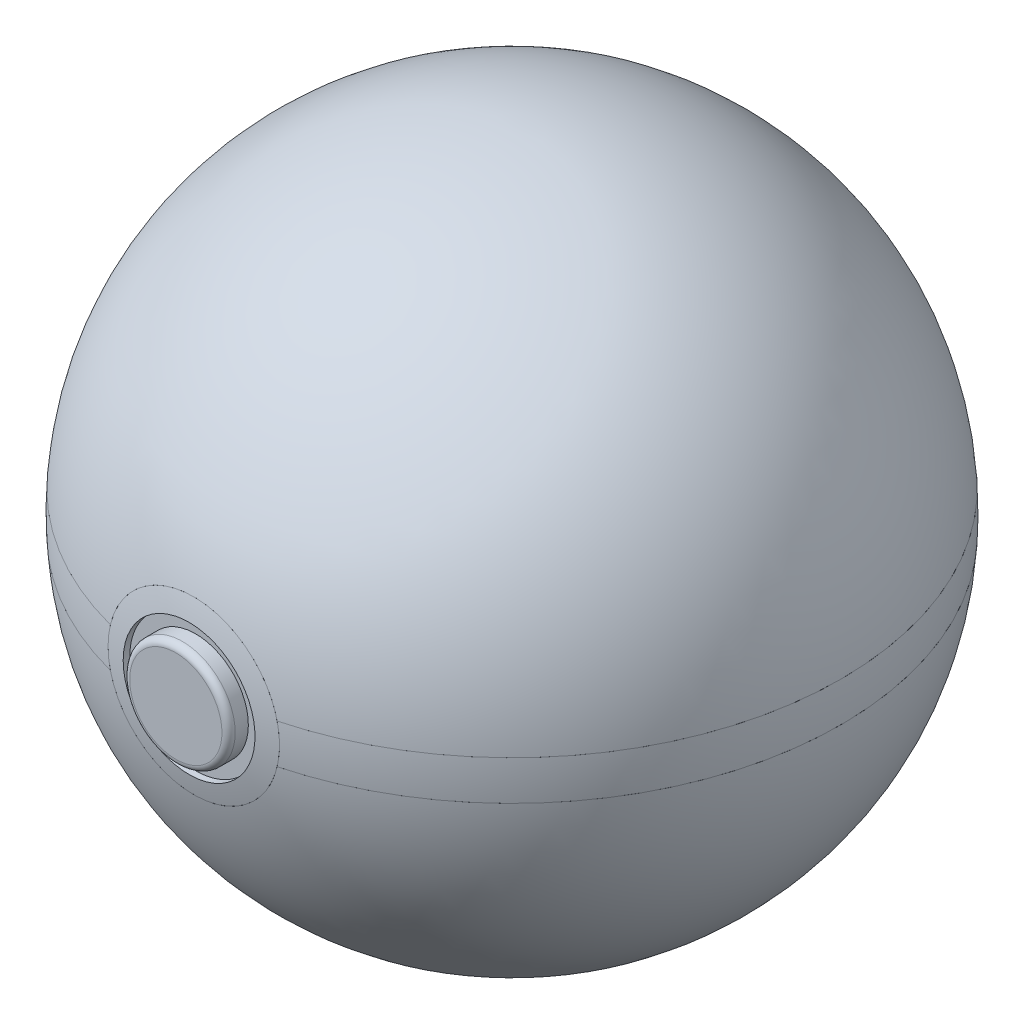
ISO-10303-21;
HEADER;
FILE_DESCRIPTION(('STEP AP214'),'2;1');
FILE_NAME('part.step','',(''),(''),'','','');
FILE_SCHEMA(('AUTOMOTIVE_DESIGN { 1 0 10303 214 1 1 1 1 }'));
ENDSEC;
DATA;
#1=APPLICATION_CONTEXT('core data for automotive mechanical design processes');
#2=APPLICATION_PROTOCOL_DEFINITION('international standard','automotive_design',2000,#1);
#3=PRODUCT_CONTEXT('',#1,'mechanical');
#4=PRODUCT('Part','Part','',(#3));
#5=PRODUCT_RELATED_PRODUCT_CATEGORY('part','',(#4));
#6=PRODUCT_DEFINITION_FORMATION('','',#4);
#7=PRODUCT_DEFINITION_CONTEXT('part definition',#1,'design');
#8=PRODUCT_DEFINITION('design','',#6,#7);
#9=PRODUCT_DEFINITION_SHAPE('','',#8);
#10=(LENGTH_UNIT() NAMED_UNIT(*) SI_UNIT(.MILLI.,.METRE.));
#11=(NAMED_UNIT(*) PLANE_ANGLE_UNIT() SI_UNIT($,.RADIAN.));
#12=(NAMED_UNIT(*) SI_UNIT($,.STERADIAN.) SOLID_ANGLE_UNIT());
#13=UNCERTAINTY_MEASURE_WITH_UNIT(LENGTH_MEASURE(1.E-05),#10,'distance_accuracy_value','');
#14=(GEOMETRIC_REPRESENTATION_CONTEXT(3) GLOBAL_UNCERTAINTY_ASSIGNED_CONTEXT((#13)) GLOBAL_UNIT_ASSIGNED_CONTEXT((#10,
#11,#12)) REPRESENTATION_CONTEXT('',''));
#15=CARTESIAN_POINT('',(0.,0.,0.));
#16=DIRECTION('',(0.,0.,1.));
#17=DIRECTION('',(1.,0.,0.));
#18=AXIS2_PLACEMENT_3D('',#15,#16,#17);
#19=CARTESIAN_POINT('',(0.,0.,51.));
#20=DIRECTION('',(0.,0.,-1.));
#21=DIRECTION('',(-1.,0.,0.));
#22=AXIS2_PLACEMENT_3D('',#19,#20,#21);
#23=CYLINDRICAL_SURFACE('',#22,8.);
#24=CARTESIAN_POINT('',(0.,0.,50.));
#25=DIRECTION('',(0.,0.,1.));
#26=DIRECTION('',(1.,0.,0.));
#27=AXIS2_PLACEMENT_3D('',#24,#25,#26);
#28=CIRCLE('',#27,8.);
#29=CARTESIAN_POINT('',(8.,0.,50.));
#30=VERTEX_POINT('',#29);
#31=EDGE_CURVE('E11',#30,#30,#28,.F.);
#32=ORIENTED_EDGE('',*,*,#31,.T.);
#33=EDGE_LOOP('',(#32));
#34=FACE_BOUND('',#33,.T.);
#35=CARTESIAN_POINT('',(0.,0.,48.));
#36=DIRECTION('',(0.,0.,1.));
#37=DIRECTION('',(1.,0.,0.));
#38=AXIS2_PLACEMENT_3D('',#35,#36,#37);
#39=CIRCLE('',#38,8.);
#40=CARTESIAN_POINT('',(8.,0.,48.));
#41=VERTEX_POINT('',#40);
#42=EDGE_CURVE('E63',#41,#41,#39,.T.);
#43=ORIENTED_EDGE('',*,*,#42,.T.);
#44=EDGE_LOOP('',(#43));
#45=FACE_BOUND('',#44,.T.);
#46=ADVANCED_FACE('F52',(#34,#45),#23,.T.);
#47=CARTESIAN_POINT('',(0.,0.,51.));
#48=DIRECTION('',(0.,0.,1.));
#49=DIRECTION('',(1.,0.,0.));
#50=AXIS2_PLACEMENT_3D('',#47,#48,#49);
#51=PLANE('',#50);
#52=CARTESIAN_POINT('',(0.,0.,51.));
#53=DIRECTION('',(0.,0.,1.));
#54=DIRECTION('',(1.,0.,0.));
#55=AXIS2_PLACEMENT_3D('',#52,#53,#54);
#56=CIRCLE('',#55,7.);
#57=CARTESIAN_POINT('',(7.,0.,51.));
#58=VERTEX_POINT('',#57);
#59=EDGE_CURVE('E59',#58,#58,#56,.T.);
#60=ORIENTED_EDGE('',*,*,#59,.T.);
#61=EDGE_LOOP('',(#60));
#62=FACE_BOUND('',#61,.T.);
#63=ADVANCED_FACE('F73',(#62),#51,.T.);
#64=CARTESIAN_POINT('',(0.,0.,48.));
#65=DIRECTION('',(0.,0.,1.));
#66=DIRECTION('',(1.,0.,0.));
#67=AXIS2_PLACEMENT_3D('',#64,#65,#66);
#68=PLANE('',#67);
#69=ORIENTED_EDGE('',*,*,#42,.F.);
#70=EDGE_LOOP('',(#69));
#71=FACE_BOUND('',#70,.T.);
#72=ADVANCED_FACE('F71',(#71),#68,.F.);
#73=CARTESIAN_POINT('',(0.,0.,50.));
#74=DIRECTION('',(0.,0.,1.));
#75=DIRECTION('',(1.,0.,0.));
#76=AXIS2_PLACEMENT_3D('',#73,#74,#75);
#77=TOROIDAL_SURFACE('',#76,7.,1.);
#78=ORIENTED_EDGE('',*,*,#31,.F.);
#79=EDGE_LOOP('',(#78));
#80=FACE_BOUND('',#79,.T.);
#81=ORIENTED_EDGE('',*,*,#59,.F.);
#82=EDGE_LOOP('',(#81));
#83=FACE_BOUND('',#82,.T.);
#84=ADVANCED_FACE('F54',(#80,#83),#77,.T.);
#85=CLOSED_SHELL('',(#46,#63,#72,#84));
#86=MANIFOLD_SOLID_BREP('B2',#85);
#87=CARTESIAN_POINT('',(0.,0.,48.));
#88=DIRECTION('',(0.,0.,-1.));
#89=DIRECTION('',(-1.,0.,0.));
#90=AXIS2_PLACEMENT_3D('',#87,#88,#89);
#91=CYLINDRICAL_SURFACE('',#90,10.);
#92=CARTESIAN_POINT('',(0.,0.,48.));
#93=DIRECTION('',(0.,0.,1.));
#94=DIRECTION('',(1.,0.,0.));
#95=AXIS2_PLACEMENT_3D('',#92,#93,#94);
#96=CIRCLE('',#95,10.);
#97=CARTESIAN_POINT('',(10.,0.,48.));
#98=VERTEX_POINT('',#97);
#99=EDGE_CURVE('E51',#98,#98,#96,.T.);
#100=ORIENTED_EDGE('',*,*,#99,.F.);
#101=EDGE_LOOP('',(#100));
#102=FACE_BOUND('',#101,.T.);
#103=CARTESIAN_POINT('',(0.,0.,0.));
#104=DIRECTION('',(0.,0.,1.));
#105=DIRECTION('',(1.,0.,0.));
#106=AXIS2_PLACEMENT_3D('',#103,#104,#105);
#107=CIRCLE('',#106,10.);
#108=CARTESIAN_POINT('',(10.,0.,0.));
#109=VERTEX_POINT('',#108);
#110=EDGE_CURVE('E133',#109,#109,#107,.T.);
#111=ORIENTED_EDGE('',*,*,#110,.T.);
#112=EDGE_LOOP('',(#111));
#113=FACE_BOUND('',#112,.T.);
#114=ADVANCED_FACE('F130',(#102,#113),#91,.T.);
#115=CARTESIAN_POINT('',(0.,0.,48.));
#116=DIRECTION('',(0.,0.,1.));
#117=DIRECTION('',(1.,0.,0.));
#118=AXIS2_PLACEMENT_3D('',#115,#116,#117);
#119=PLANE('',#118);
#120=ORIENTED_EDGE('',*,*,#99,.T.);
#121=EDGE_LOOP('',(#120));
#122=FACE_BOUND('',#121,.T.);
#123=ADVANCED_FACE('F145',(#122),#119,.T.);
#124=CARTESIAN_POINT('',(0.,0.,0.));
#125=DIRECTION('',(0.,0.,1.));
#126=DIRECTION('',(1.,0.,0.));
#127=AXIS2_PLACEMENT_3D('',#124,#125,#126);
#128=PLANE('',#127);
#129=ORIENTED_EDGE('',*,*,#110,.F.);
#130=EDGE_LOOP('',(#129));
#131=FACE_BOUND('',#130,.T.);
#132=ADVANCED_FACE('F143',(#131),#128,.F.);
#133=CLOSED_SHELL('',(#114,#123,#132));
#134=MANIFOLD_SOLID_BREP('B6',#133);
#135=CARTESIAN_POINT('',(0.,0.,0.));
#136=DIRECTION('',(0.,-1.,0.));
#137=DIRECTION('',(1.,0.,0.));
#138=AXIS2_PLACEMENT_3D('',#135,#136,#137);
#139=SPHERICAL_SURFACE('',#138,50.);
#140=CARTESIAN_POINT('',(0.,0.,0.));
#141=DIRECTION('',(0.,0.,-1.));
#142=DIRECTION('',(-1.,0.,0.));
#143=AXIS2_PLACEMENT_3D('',#140,#141,#142);
#144=SPHERICAL_SURFACE('',#143,50.);
#145=CARTESIAN_POINT('',(0.,0.,48.2804308182933));
#146=DIRECTION('',(0.,0.,-1.));
#147=DIRECTION('',(-1.,0.,0.));
#148=AXIS2_PLACEMENT_3D('',#145,#146,#147);
#149=CIRCLE('',#148,13.);
#150=CARTESIAN_POINT('',(-13.,0.,48.2804308182933));
#151=VERTEX_POINT('',#150);
#152=EDGE_CURVE('E129',#151,#151,#149,.F.);
#153=ORIENTED_EDGE('',*,*,#152,.T.);
#154=EDGE_LOOP('',(#153));
#155=FACE_BOUND('',#154,.T.);
#156=CARTESIAN_POINT('',(0.,0.,48.9897948556636));
#157=DIRECTION('',(0.,0.,-1.));
#158=DIRECTION('',(-1.,0.,0.));
#159=AXIS2_PLACEMENT_3D('',#156,#157,#158);
#160=CIRCLE('',#159,10.);
#161=CARTESIAN_POINT('',(-10.,0.,48.9897948556636));
#162=VERTEX_POINT('',#161);
#163=EDGE_CURVE('E192',#162,#162,#160,.T.);
#164=ORIENTED_EDGE('',*,*,#163,.T.);
#165=EDGE_LOOP('',(#164));
#166=FACE_BOUND('',#165,.T.);
#167=ADVANCED_FACE('F189',(#155,#166),#144,.T.);
#168=CARTESIAN_POINT('',(0.,0.,50.001));
#169=DIRECTION('',(0.,0.,-1.));
#170=DIRECTION('',(-1.,0.,0.));
#171=AXIS2_PLACEMENT_3D('',#168,#169,#170);
#172=CYLINDRICAL_SURFACE('',#171,13.);
#173=CARTESIAN_POINT('',(0.,0.,0.));
#174=DIRECTION('',(0.,0.,1.));
#175=DIRECTION('',(1.,0.,0.));
#176=AXIS2_PLACEMENT_3D('',#173,#174,#175);
#177=CIRCLE('',#176,13.);
#178=CARTESIAN_POINT('',(13.,0.,0.));
#179=VERTEX_POINT('',#178);
#180=EDGE_CURVE('E196',#179,#179,#177,.T.);
#181=ORIENTED_EDGE('',*,*,#180,.T.);
#182=EDGE_LOOP('',(#181));
#183=FACE_BOUND('',#182,.T.);
#184=ORIENTED_EDGE('',*,*,#152,.F.);
#185=EDGE_LOOP('',(#184));
#186=FACE_BOUND('',#185,.T.);
#187=ADVANCED_FACE('F218',(#183,#186),#172,.T.);
#188=CARTESIAN_POINT('',(0.,0.,0.));
#189=DIRECTION('',(0.,0.,1.));
#190=DIRECTION('',(1.,0.,0.));
#191=AXIS2_PLACEMENT_3D('',#188,#189,#190);
#192=PLANE('',#191);
#193=CARTESIAN_POINT('',(0.,0.,0.));
#194=DIRECTION('',(0.,0.,1.));
#195=DIRECTION('',(1.,0.,0.));
#196=AXIS2_PLACEMENT_3D('',#193,#194,#195);
#197=CIRCLE('',#196,10.);
#198=CARTESIAN_POINT('',(10.,0.,0.));
#199=VERTEX_POINT('',#198);
#200=EDGE_CURVE('E202',#199,#199,#197,.T.);
#201=ORIENTED_EDGE('',*,*,#200,.T.);
#202=EDGE_LOOP('',(#201));
#203=FACE_BOUND('',#202,.T.);
#204=ORIENTED_EDGE('',*,*,#180,.F.);
#205=EDGE_LOOP('',(#204));
#206=FACE_BOUND('',#205,.T.);
#207=ADVANCED_FACE('F213',(#203,#206),#192,.F.);
#208=CARTESIAN_POINT('',(0.,0.,70.));
#209=DIRECTION('',(0.,0.,-1.));
#210=DIRECTION('',(-1.,0.,0.));
#211=AXIS2_PLACEMENT_3D('',#208,#209,#210);
#212=CYLINDRICAL_SURFACE('',#211,10.);
#213=ORIENTED_EDGE('',*,*,#163,.F.);
#214=EDGE_LOOP('',(#213));
#215=FACE_BOUND('',#214,.T.);
#216=ORIENTED_EDGE('',*,*,#200,.F.);
#217=EDGE_LOOP('',(#216));
#218=FACE_BOUND('',#217,.T.);
#219=ADVANCED_FACE('F210',(#215,#218),#212,.F.);
#220=CLOSED_SHELL('',(#167,#187,#207,#219));
#221=MANIFOLD_SOLID_BREP('B46',#220);
#222=CARTESIAN_POINT('',(0.,0.,0.));
#223=DIRECTION('',(0.,1.,0.));
#224=DIRECTION('',(1.,0.,0.));
#225=AXIS2_PLACEMENT_3D('',#222,#223,#224);
#226=SPHERICAL_SURFACE('',#225,50.);
#227=CARTESIAN_POINT('',(0.,0.,48.2804308182933));
#228=DIRECTION('',(0.,0.,-1.));
#229=DIRECTION('',(-1.,0.,0.));
#230=AXIS2_PLACEMENT_3D('',#227,#228,#229);
#231=CIRCLE('',#230,13.);
#232=CARTESIAN_POINT('',(12.6491106406735,-2.99999999999995,48.2804308182933));
#233=VERTEX_POINT('',#232);
#234=CARTESIAN_POINT('',(12.6491106406735,3.00000000000005,48.2804308182933));
#235=VERTEX_POINT('',#234);
#236=EDGE_CURVE('E292',#233,#235,#231,.F.);
#237=ORIENTED_EDGE('',*,*,#236,.F.);
#238=CARTESIAN_POINT('',(0.,-2.99999999999994,0.));
#239=DIRECTION('',(0.,1.,0.));
#240=DIRECTION('',(-1.,0.,0.));
#241=AXIS2_PLACEMENT_3D('',#238,#239,#240);
#242=CIRCLE('',#241,49.9099188538711);
#243=CARTESIAN_POINT('',(-12.6491106406735,-2.99999999999992,48.2804308182933));
#244=VERTEX_POINT('',#243);
#245=EDGE_CURVE('E317',#233,#244,#242,.T.);
#246=ORIENTED_EDGE('',*,*,#245,.T.);
#247=CARTESIAN_POINT('',(-12.6491106406735,3.00000000000008,48.2804308182933));
#248=VERTEX_POINT('',#247);
#249=EDGE_CURVE('E327',#248,#244,#231,.F.);
#250=ORIENTED_EDGE('',*,*,#249,.F.);
#251=CARTESIAN_POINT('',(0.,3.00000000000006,0.));
#252=DIRECTION('',(0.,1.,0.));
#253=DIRECTION('',(-1.,0.,0.));
#254=AXIS2_PLACEMENT_3D('',#251,#252,#253);
#255=CIRCLE('',#254,49.9099188538711);
#256=EDGE_CURVE('E334',#235,#248,#255,.T.);
#257=ORIENTED_EDGE('',*,*,#256,.F.);
#258=EDGE_LOOP('',(#237,#246,#250,#257));
#259=FACE_BOUND('',#258,.T.);
#260=ADVANCED_FACE('F271',(#259),#226,.T.);
#261=CARTESIAN_POINT('',(49.9099188538711,2.99999999999997,0.));
#262=DIRECTION('',(0.,-1.,0.));
#263=DIRECTION('',(1.,0.,0.));
#264=AXIS2_PLACEMENT_3D('',#261,#262,#263);
#265=PLANE('',#264);
#266=DIRECTION('',(0.,0.,-1.));
#267=VECTOR('',#266,1.);
#268=CARTESIAN_POINT('',(-12.6491106406735,3.00000000000005,70.));
#269=LINE('',#268,#267);
#270=CARTESIAN_POINT('',(-12.6491106406735,3.00000000000005,0.));
#271=VERTEX_POINT('',#270);
#272=EDGE_CURVE('E326',#271,#248,#269,.F.);
#273=ORIENTED_EDGE('',*,*,#272,.F.);
#274=DIRECTION('',(-1.,0.,0.));
#275=VECTOR('',#274,1.);
#276=CARTESIAN_POINT('',(49.9099188538711,2.99999999999997,0.));
#277=LINE('',#276,#275);
#278=CARTESIAN_POINT('',(12.6491106406735,3.00000000000002,0.));
#279=VERTEX_POINT('',#278);
#280=EDGE_CURVE('E320',#279,#271,#277,.T.);
#281=ORIENTED_EDGE('',*,*,#280,.F.);
#282=DIRECTION('',(0.,0.,-1.));
#283=VECTOR('',#282,1.);
#284=CARTESIAN_POINT('',(12.6491106406735,3.00000000000002,70.));
#285=LINE('',#284,#283);
#286=EDGE_CURVE('E308',#235,#279,#285,.T.);
#287=ORIENTED_EDGE('',*,*,#286,.F.);
#288=ORIENTED_EDGE('',*,*,#256,.T.);
#289=EDGE_LOOP('',(#273,#281,#287,#288));
#290=FACE_BOUND('',#289,.T.);
#291=ADVANCED_FACE('F325',(#290),#265,.F.);
#292=CARTESIAN_POINT('',(0.,-2.99999999999997,0.));
#293=DIRECTION('',(0.,1.,0.));
#294=DIRECTION('',(-1.,0.,0.));
#295=AXIS2_PLACEMENT_3D('',#292,#293,#294);
#296=PLANE('',#295);
#297=DIRECTION('',(0.,0.,-1.));
#298=VECTOR('',#297,1.);
#299=CARTESIAN_POINT('',(12.6491106406735,-2.99999999999998,70.));
#300=LINE('',#299,#298);
#301=CARTESIAN_POINT('',(12.6491106406735,-2.99999999999998,0.));
#302=VERTEX_POINT('',#301);
#303=EDGE_CURVE('E187',#302,#233,#300,.F.);
#304=ORIENTED_EDGE('',*,*,#303,.F.);
#305=DIRECTION('',(1.,0.,0.));
#306=VECTOR('',#305,1.);
#307=CARTESIAN_POINT('',(0.,-2.99999999999997,0.));
#308=LINE('',#307,#306);
#309=CARTESIAN_POINT('',(-12.6491106406735,-2.99999999999995,0.));
#310=VERTEX_POINT('',#309);
#311=EDGE_CURVE('E322',#310,#302,#308,.T.);
#312=ORIENTED_EDGE('',*,*,#311,.F.);
#313=DIRECTION('',(0.,0.,-1.));
#314=VECTOR('',#313,1.);
#315=CARTESIAN_POINT('',(-12.6491106406735,-2.99999999999995,70.));
#316=LINE('',#315,#314);
#317=EDGE_CURVE('E278',#244,#310,#316,.T.);
#318=ORIENTED_EDGE('',*,*,#317,.F.);
#319=ORIENTED_EDGE('',*,*,#245,.F.);
#320=EDGE_LOOP('',(#304,#312,#318,#319));
#321=FACE_BOUND('',#320,.T.);
#322=ADVANCED_FACE('F342',(#321),#296,.F.);
#323=CARTESIAN_POINT('',(0.,0.,70.));
#324=DIRECTION('',(0.,0.,-1.));
#325=DIRECTION('',(-1.,0.,0.));
#326=AXIS2_PLACEMENT_3D('',#323,#324,#325);
#327=CYLINDRICAL_SURFACE('',#326,13.);
#328=ORIENTED_EDGE('',*,*,#286,.T.);
#329=CARTESIAN_POINT('',(0.,0.,0.));
#330=DIRECTION('',(0.,0.,1.));
#331=DIRECTION('',(1.,0.,0.));
#332=AXIS2_PLACEMENT_3D('',#329,#330,#331);
#333=CIRCLE('',#332,13.);
#334=EDGE_CURVE('E311',#302,#279,#333,.T.);
#335=ORIENTED_EDGE('',*,*,#334,.F.);
#336=ORIENTED_EDGE('',*,*,#303,.T.);
#337=ORIENTED_EDGE('',*,*,#236,.T.);
#338=EDGE_LOOP('',(#328,#335,#336,#337));
#339=FACE_BOUND('',#338,.T.);
#340=ADVANCED_FACE('F310',(#339),#327,.F.);
#341=ORIENTED_EDGE('',*,*,#272,.T.);
#342=ORIENTED_EDGE('',*,*,#249,.T.);
#343=ORIENTED_EDGE('',*,*,#317,.T.);
#344=EDGE_CURVE('E285',#271,#310,#333,.T.);
#345=ORIENTED_EDGE('',*,*,#344,.F.);
#346=EDGE_LOOP('',(#341,#342,#343,#345));
#347=FACE_BOUND('',#346,.T.);
#348=ADVANCED_FACE('F338',(#347),#327,.F.);
#349=CARTESIAN_POINT('',(0.,0.,0.));
#350=DIRECTION('',(0.,0.,1.));
#351=DIRECTION('',(1.,0.,0.));
#352=AXIS2_PLACEMENT_3D('',#349,#350,#351);
#353=PLANE('',#352);
#354=ORIENTED_EDGE('',*,*,#280,.T.);
#355=ORIENTED_EDGE('',*,*,#344,.T.);
#356=ORIENTED_EDGE('',*,*,#311,.T.);
#357=ORIENTED_EDGE('',*,*,#334,.T.);
#358=EDGE_LOOP('',(#354,#355,#356,#357));
#359=FACE_BOUND('',#358,.T.);
#360=ADVANCED_FACE('F319',(#359),#353,.T.);
#361=CLOSED_SHELL('',(#260,#291,#322,#340,#348,#360));
#362=MANIFOLD_SOLID_BREP('B124',#361);
#363=CARTESIAN_POINT('',(0.,0.,0.));
#364=DIRECTION('',(0.,-1.,0.));
#365=DIRECTION('',(1.,0.,0.));
#366=AXIS2_PLACEMENT_3D('',#363,#364,#365);
#367=SPHERICAL_SURFACE('',#366,50.);
#368=CARTESIAN_POINT('',(0.,-2.99999999999994,0.));
#369=DIRECTION('',(0.,-1.,0.));
#370=DIRECTION('',(1.,0.,0.));
#371=AXIS2_PLACEMENT_3D('',#368,#369,#370);
#372=CIRCLE('',#371,49.9099188538711);
#373=CARTESIAN_POINT('',(-12.6491106406735,-2.99999999999992,48.2804308182933));
#374=VERTEX_POINT('',#373);
#375=CARTESIAN_POINT('',(12.6491106406735,-2.99999999999995,48.2804308182933));
#376=VERTEX_POINT('',#375);
#377=EDGE_CURVE('E446',#374,#376,#372,.T.);
#378=ORIENTED_EDGE('',*,*,#377,.T.);
#379=CARTESIAN_POINT('',(0.,0.,48.2804308182933));
#380=DIRECTION('',(0.,0.,-1.));
#381=DIRECTION('',(-1.,0.,0.));
#382=AXIS2_PLACEMENT_3D('',#379,#380,#381);
#383=CIRCLE('',#382,13.);
#384=EDGE_CURVE('E436',#376,#374,#383,.T.);
#385=ORIENTED_EDGE('',*,*,#384,.T.);
#386=EDGE_LOOP('',(#378,#385));
#387=FACE_BOUND('',#386,.T.);
#388=ADVANCED_FACE('F415',(#387),#367,.T.);
#389=CARTESIAN_POINT('',(49.9099188538711,-3.00000000000003,0.));
#390=DIRECTION('',(0.,1.,0.));
#391=DIRECTION('',(-1.,0.,0.));
#392=AXIS2_PLACEMENT_3D('',#389,#390,#391);
#393=PLANE('',#392);
#394=DIRECTION('',(1.,0.,0.));
#395=VECTOR('',#394,1.);
#396=CARTESIAN_POINT('',(49.9099188538711,-3.00000000000003,0.));
#397=LINE('',#396,#395);
#398=CARTESIAN_POINT('',(-12.6491106406735,-2.99999999999995,0.));
#399=VERTEX_POINT('',#398);
#400=CARTESIAN_POINT('',(12.6491106406735,-2.99999999999999,0.));
#401=VERTEX_POINT('',#400);
#402=EDGE_CURVE('E441',#399,#401,#397,.T.);
#403=ORIENTED_EDGE('',*,*,#402,.T.);
#404=DIRECTION('',(0.,0.,-1.));
#405=VECTOR('',#404,1.);
#406=CARTESIAN_POINT('',(12.6491106406735,-2.99999999999999,70.));
#407=LINE('',#406,#405);
#408=EDGE_CURVE('E269',#401,#376,#407,.F.);
#409=ORIENTED_EDGE('',*,*,#408,.T.);
#410=ORIENTED_EDGE('',*,*,#377,.F.);
#411=DIRECTION('',(0.,0.,-1.));
#412=VECTOR('',#411,1.);
#413=CARTESIAN_POINT('',(-12.6491106406735,-2.99999999999995,70.));
#414=LINE('',#413,#412);
#415=EDGE_CURVE('E423',#374,#399,#414,.T.);
#416=ORIENTED_EDGE('',*,*,#415,.T.);
#417=EDGE_LOOP('',(#403,#409,#410,#416));
#418=FACE_BOUND('',#417,.T.);
#419=ADVANCED_FACE('F452',(#418),#393,.T.);
#420=CARTESIAN_POINT('',(0.,0.,70.));
#421=DIRECTION('',(0.,0.,-1.));
#422=DIRECTION('',(-1.,0.,0.));
#423=AXIS2_PLACEMENT_3D('',#420,#421,#422);
#424=CYLINDRICAL_SURFACE('',#423,13.);
#425=CARTESIAN_POINT('',(0.,0.,0.));
#426=DIRECTION('',(0.,0.,1.));
#427=DIRECTION('',(1.,0.,0.));
#428=AXIS2_PLACEMENT_3D('',#425,#426,#427);
#429=CIRCLE('',#428,13.);
#430=EDGE_CURVE('E429',#399,#401,#429,.T.);
#431=ORIENTED_EDGE('',*,*,#430,.F.);
#432=ORIENTED_EDGE('',*,*,#415,.F.);
#433=ORIENTED_EDGE('',*,*,#384,.F.);
#434=ORIENTED_EDGE('',*,*,#408,.F.);
#435=EDGE_LOOP('',(#431,#432,#433,#434));
#436=FACE_BOUND('',#435,.T.);
#437=ADVANCED_FACE('F448',(#436),#424,.F.);
#438=CARTESIAN_POINT('',(0.,0.,0.));
#439=DIRECTION('',(0.,0.,1.));
#440=DIRECTION('',(1.,0.,0.));
#441=AXIS2_PLACEMENT_3D('',#438,#439,#440);
#442=PLANE('',#441);
#443=ORIENTED_EDGE('',*,*,#430,.T.);
#444=ORIENTED_EDGE('',*,*,#402,.F.);
#445=EDGE_LOOP('',(#443,#444));
#446=FACE_BOUND('',#445,.T.);
#447=ADVANCED_FACE('F442',(#446),#442,.T.);
#448=CLOSED_SHELL('',(#388,#419,#437,#447));
#449=MANIFOLD_SOLID_BREP('B181',#448);
#450=CARTESIAN_POINT('',(0.,0.,0.));
#451=DIRECTION('',(0.,-1.,0.));
#452=DIRECTION('',(1.,0.,0.));
#453=AXIS2_PLACEMENT_3D('',#450,#451,#452);
#454=SPHERICAL_SURFACE('',#453,50.);
#455=CARTESIAN_POINT('',(0.,3.00000000000006,0.));
#456=DIRECTION('',(0.,-1.,0.));
#457=DIRECTION('',(1.,0.,0.));
#458=AXIS2_PLACEMENT_3D('',#455,#456,#457);
#459=CIRCLE('',#458,49.9099188538711);
#460=CARTESIAN_POINT('',(-12.6491106406735,3.00000000000008,48.2804308182933));
#461=VERTEX_POINT('',#460);
#462=CARTESIAN_POINT('',(12.6491106406735,3.00000000000005,48.2804308182932));
#463=VERTEX_POINT('',#462);
#464=EDGE_CURVE('E532',#461,#463,#459,.T.);
#465=ORIENTED_EDGE('',*,*,#464,.F.);
#466=CARTESIAN_POINT('',(0.,0.,48.2804308182933));
#467=DIRECTION('',(0.,0.,-1.));
#468=DIRECTION('',(-1.,0.,0.));
#469=AXIS2_PLACEMENT_3D('',#466,#467,#468);
#470=CIRCLE('',#469,13.);
#471=EDGE_CURVE('E523',#461,#463,#470,.T.);
#472=ORIENTED_EDGE('',*,*,#471,.T.);
#473=EDGE_LOOP('',(#465,#472));
#474=FACE_BOUND('',#473,.T.);
#475=ADVANCED_FACE('F503',(#474),#454,.T.);
#476=CARTESIAN_POINT('',(49.9099188538711,2.99999999999997,0.));
#477=DIRECTION('',(0.,-1.,0.));
#478=DIRECTION('',(1.,0.,0.));
#479=AXIS2_PLACEMENT_3D('',#476,#477,#478);
#480=PLANE('',#479);
#481=DIRECTION('',(-1.,0.,0.));
#482=VECTOR('',#481,1.);
#483=CARTESIAN_POINT('',(49.9099188538711,2.99999999999997,0.));
#484=LINE('',#483,#482);
#485=CARTESIAN_POINT('',(12.6491106406735,3.00000000000002,0.));
#486=VERTEX_POINT('',#485);
#487=CARTESIAN_POINT('',(-12.6491106406735,3.00000000000005,0.));
#488=VERTEX_POINT('',#487);
#489=EDGE_CURVE('E528',#486,#488,#484,.T.);
#490=ORIENTED_EDGE('',*,*,#489,.T.);
#491=DIRECTION('',(0.,0.,-1.));
#492=VECTOR('',#491,1.);
#493=CARTESIAN_POINT('',(-12.6491106406735,3.00000000000005,70.));
#494=LINE('',#493,#492);
#495=EDGE_CURVE('E413',#488,#461,#494,.F.);
#496=ORIENTED_EDGE('',*,*,#495,.T.);
#497=ORIENTED_EDGE('',*,*,#464,.T.);
#498=DIRECTION('',(0.,0.,-1.));
#499=VECTOR('',#498,1.);
#500=CARTESIAN_POINT('',(12.6491106406735,3.00000000000002,70.));
#501=LINE('',#500,#499);
#502=EDGE_CURVE('E510',#463,#486,#501,.T.);
#503=ORIENTED_EDGE('',*,*,#502,.T.);
#504=EDGE_LOOP('',(#490,#496,#497,#503));
#505=FACE_BOUND('',#504,.T.);
#506=ADVANCED_FACE('F537',(#505),#480,.T.);
#507=CARTESIAN_POINT('',(0.,0.,70.));
#508=DIRECTION('',(0.,0.,-1.));
#509=DIRECTION('',(-1.,0.,0.));
#510=AXIS2_PLACEMENT_3D('',#507,#508,#509);
#511=CYLINDRICAL_SURFACE('',#510,13.);
#512=CARTESIAN_POINT('',(0.,0.,0.));
#513=DIRECTION('',(0.,0.,1.));
#514=DIRECTION('',(1.,0.,0.));
#515=AXIS2_PLACEMENT_3D('',#512,#513,#514);
#516=CIRCLE('',#515,13.);
#517=EDGE_CURVE('E516',#486,#488,#516,.T.);
#518=ORIENTED_EDGE('',*,*,#517,.F.);
#519=ORIENTED_EDGE('',*,*,#502,.F.);
#520=ORIENTED_EDGE('',*,*,#471,.F.);
#521=ORIENTED_EDGE('',*,*,#495,.F.);
#522=EDGE_LOOP('',(#518,#519,#520,#521));
#523=FACE_BOUND('',#522,.T.);
#524=ADVANCED_FACE('F534',(#523),#511,.F.);
#525=CARTESIAN_POINT('',(0.,0.,0.));
#526=DIRECTION('',(0.,0.,1.));
#527=DIRECTION('',(1.,0.,0.));
#528=AXIS2_PLACEMENT_3D('',#525,#526,#527);
#529=PLANE('',#528);
#530=ORIENTED_EDGE('',*,*,#517,.T.);
#531=ORIENTED_EDGE('',*,*,#489,.F.);
#532=EDGE_LOOP('',(#530,#531));
#533=FACE_BOUND('',#532,.T.);
#534=ADVANCED_FACE('F529',(#533),#529,.T.);
#535=CLOSED_SHELL('',(#475,#506,#524,#534));
#536=MANIFOLD_SOLID_BREP('B263',#535);
#537=ADVANCED_BREP_SHAPE_REPRESENTATION('',(#18,#86,#134,#221,#362,#449,#536),#14);
#538=SHAPE_DEFINITION_REPRESENTATION(#9,#537);
ENDSEC;
END-ISO-10303-21;
